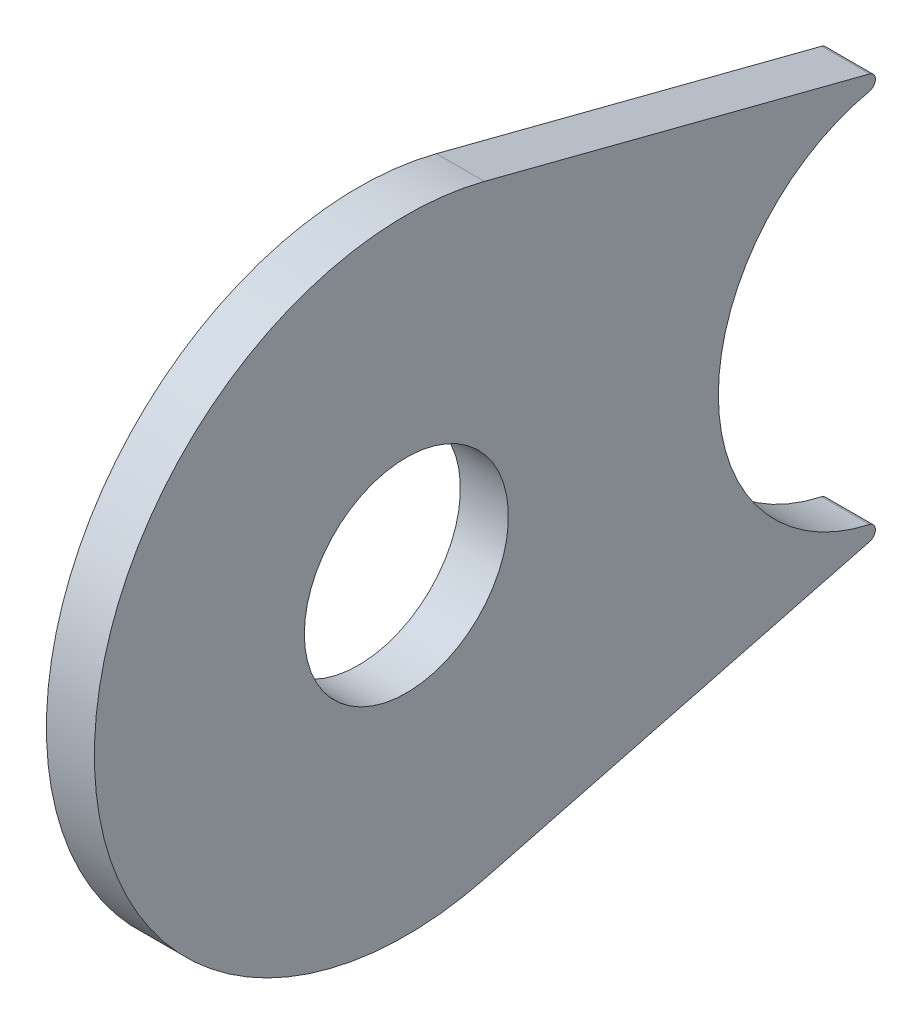
ISO-10303-21;
HEADER;
FILE_DESCRIPTION(('STEP AP214'),'2;1');
FILE_NAME('part.step','',(''),(''),'','','');
FILE_SCHEMA(('AUTOMOTIVE_DESIGN { 1 0 10303 214 1 1 1 1 }'));
ENDSEC;
DATA;
#1=APPLICATION_CONTEXT('core data for automotive mechanical design processes');
#2=APPLICATION_PROTOCOL_DEFINITION('international standard','automotive_design',2000,#1);
#3=PRODUCT_CONTEXT('',#1,'mechanical');
#4=PRODUCT('Part','Part','',(#3));
#5=PRODUCT_RELATED_PRODUCT_CATEGORY('part','',(#4));
#6=PRODUCT_DEFINITION_FORMATION('','',#4);
#7=PRODUCT_DEFINITION_CONTEXT('part definition',#1,'design');
#8=PRODUCT_DEFINITION('design','',#6,#7);
#9=PRODUCT_DEFINITION_SHAPE('','',#8);
#10=(LENGTH_UNIT() NAMED_UNIT(*) SI_UNIT(.MILLI.,.METRE.));
#11=(NAMED_UNIT(*) PLANE_ANGLE_UNIT() SI_UNIT($,.RADIAN.));
#12=(NAMED_UNIT(*) SI_UNIT($,.STERADIAN.) SOLID_ANGLE_UNIT());
#13=UNCERTAINTY_MEASURE_WITH_UNIT(LENGTH_MEASURE(1.E-05),#10,'distance_accuracy_value','');
#14=(GEOMETRIC_REPRESENTATION_CONTEXT(3) GLOBAL_UNCERTAINTY_ASSIGNED_CONTEXT((#13)) GLOBAL_UNIT_ASSIGNED_CONTEXT((#10,
#11,#12)) REPRESENTATION_CONTEXT('',''));
#15=CARTESIAN_POINT('',(0.,0.,0.));
#16=DIRECTION('',(0.,0.,1.));
#17=DIRECTION('',(1.,0.,0.));
#18=AXIS2_PLACEMENT_3D('',#15,#16,#17);
#19=CARTESIAN_POINT('',(1.5875,-19.981037813843,-5.1637713090122));
#20=DIRECTION('',(0.,-0.968190808665922,-0.250213025270125));
#21=DIRECTION('',(0.,0.250213025270125,-0.968190808665922));
#22=AXIS2_PLACEMENT_3D('',#19,#20,#21);
#23=PLANE('',#22);
#24=DIRECTION('',(0.,-0.250213025270125,0.968190808665922));
#25=VECTOR('',#24,1.);
#26=CARTESIAN_POINT('',(-1.5875,-19.981037813843,-5.1637713090122));
#27=LINE('',#26,#25);
#28=CARTESIAN_POINT('',(-1.5875,-13.3955820781879,-30.6459687575827));
#29=VERTEX_POINT('',#28);
#30=CARTESIAN_POINT('',(-1.5875,-19.981037813843,-5.16377130901221));
#31=VERTEX_POINT('',#30);
#32=EDGE_CURVE('E118',#29,#31,#27,.T.);
#33=ORIENTED_EDGE('',*,*,#32,.F.);
#34=DIRECTION('',(1.,0.,0.));
#35=VECTOR('',#34,1.);
#36=CARTESIAN_POINT('',(1.5875,-13.3955820781879,-30.6459687575827));
#37=LINE('',#36,#35);
#38=CARTESIAN_POINT('',(1.5875,-13.3955820781879,-30.6459687575827));
#39=VERTEX_POINT('',#38);
#40=EDGE_CURVE('E131',#29,#39,#37,.T.);
#41=ORIENTED_EDGE('',*,*,#40,.T.);
#42=DIRECTION('',(0.,-0.250213025270125,0.968190808665922));
#43=VECTOR('',#42,1.);
#44=CARTESIAN_POINT('',(1.5875,-19.981037813843,-5.1637713090122));
#45=LINE('',#44,#43);
#46=CARTESIAN_POINT('',(1.5875,-19.981037813843,-5.16377130901221));
#47=VERTEX_POINT('',#46);
#48=EDGE_CURVE('E125',#39,#47,#45,.T.);
#49=ORIENTED_EDGE('',*,*,#48,.T.);
#50=DIRECTION('',(-1.,0.,0.));
#51=VECTOR('',#50,1.);
#52=CARTESIAN_POINT('',(1.5875,-19.981037813843,-5.16377130901221));
#53=LINE('',#52,#51);
#54=EDGE_CURVE('E110',#47,#31,#53,.T.);
#55=ORIENTED_EDGE('',*,*,#54,.T.);
#56=EDGE_LOOP('',(#33,#41,#49,#55));
#57=FACE_BOUND('',#56,.T.);
#58=ADVANCED_FACE('F36',(#57),#23,.T.);
#59=CARTESIAN_POINT('',(1.5875,0.,-33.3375));
#60=DIRECTION('',(-1.,0.,0.));
#61=DIRECTION('',(0.,0.,1.));
#62=AXIS2_PLACEMENT_3D('',#59,#60,#61);
#63=CYLINDRICAL_SURFACE('',#62,12.7);
#64=CARTESIAN_POINT('',(-1.5875,0.,-33.3375));
#65=DIRECTION('',(1.,0.,0.));
#66=DIRECTION('',(0.,0.,-1.));
#67=AXIS2_PLACEMENT_3D('',#64,#65,#66);
#68=CIRCLE('',#67,12.7);
#69=CARTESIAN_POINT('',(-1.5875,-12.4074434109477,-30.6272697507168));
#70=VERTEX_POINT('',#69);
#71=CARTESIAN_POINT('',(-1.5875,12.4074434109477,-30.6272697507168));
#72=VERTEX_POINT('',#71);
#73=EDGE_CURVE('E120',#70,#72,#68,.F.);
#74=ORIENTED_EDGE('',*,*,#73,.T.);
#75=DIRECTION('',(-1.,0.,0.));
#76=VECTOR('',#75,1.);
#77=CARTESIAN_POINT('',(1.5875,12.4074434109477,-30.6272697507168));
#78=LINE('',#77,#76);
#79=CARTESIAN_POINT('',(1.5875,12.4074434109477,-30.6272697507168));
#80=VERTEX_POINT('',#79);
#81=EDGE_CURVE('E44',#72,#80,#78,.F.);
#82=ORIENTED_EDGE('',*,*,#81,.T.);
#83=CARTESIAN_POINT('',(1.5875,0.,-33.3375));
#84=DIRECTION('',(1.,0.,0.));
#85=DIRECTION('',(0.,0.,-1.));
#86=AXIS2_PLACEMENT_3D('',#83,#84,#85);
#87=CIRCLE('',#86,12.7);
#88=CARTESIAN_POINT('',(1.5875,-12.4074434109477,-30.6272697507168));
#89=VERTEX_POINT('',#88);
#90=EDGE_CURVE('E100',#89,#80,#87,.F.);
#91=ORIENTED_EDGE('',*,*,#90,.F.);
#92=DIRECTION('',(-1.,0.,0.));
#93=VECTOR('',#92,1.);
#94=CARTESIAN_POINT('',(1.5875,-12.4074434109477,-30.6272697507168));
#95=LINE('',#94,#93);
#96=EDGE_CURVE('E109',#89,#70,#95,.T.);
#97=ORIENTED_EDGE('',*,*,#96,.T.);
#98=EDGE_LOOP('',(#74,#82,#91,#97));
#99=FACE_BOUND('',#98,.T.);
#100=ADVANCED_FACE('F165',(#99),#63,.F.);
#101=CARTESIAN_POINT('',(1.5875,19.981037813843,-5.1637713090122));
#102=DIRECTION('',(0.,-0.968190808665922,0.250213025270125));
#103=DIRECTION('',(0.,-0.250213025270125,-0.968190808665922));
#104=AXIS2_PLACEMENT_3D('',#101,#102,#103);
#105=PLANE('',#104);
#106=DIRECTION('',(0.,0.250213025270125,0.968190808665922));
#107=VECTOR('',#106,1.);
#108=CARTESIAN_POINT('',(1.5875,19.981037813843,-5.1637713090122));
#109=LINE('',#108,#107);
#110=CARTESIAN_POINT('',(1.5875,13.3955820781879,-30.6459687575827));
#111=VERTEX_POINT('',#110);
#112=CARTESIAN_POINT('',(1.5875,19.981037813843,-5.16377130901221));
#113=VERTEX_POINT('',#112);
#114=EDGE_CURVE('E89',#111,#113,#109,.T.);
#115=ORIENTED_EDGE('',*,*,#114,.F.);
#116=DIRECTION('',(-1.,0.,0.));
#117=VECTOR('',#116,1.);
#118=CARTESIAN_POINT('',(1.5875,13.3955820781879,-30.6459687575827));
#119=LINE('',#118,#117);
#120=CARTESIAN_POINT('',(-1.5875,13.3955820781879,-30.6459687575827));
#121=VERTEX_POINT('',#120);
#122=EDGE_CURVE('E135',#111,#121,#119,.T.);
#123=ORIENTED_EDGE('',*,*,#122,.T.);
#124=DIRECTION('',(0.,0.250213025270125,0.968190808665922));
#125=VECTOR('',#124,1.);
#126=CARTESIAN_POINT('',(-1.5875,19.981037813843,-5.1637713090122));
#127=LINE('',#126,#125);
#128=CARTESIAN_POINT('',(-1.5875,19.981037813843,-5.16377130901221));
#129=VERTEX_POINT('',#128);
#130=EDGE_CURVE('E105',#121,#129,#127,.T.);
#131=ORIENTED_EDGE('',*,*,#130,.T.);
#132=DIRECTION('',(-1.,0.,0.));
#133=VECTOR('',#132,1.);
#134=CARTESIAN_POINT('',(1.5875,19.981037813843,-5.16377130901221));
#135=LINE('',#134,#133);
#136=EDGE_CURVE('E103',#113,#129,#135,.T.);
#137=ORIENTED_EDGE('',*,*,#136,.F.);
#138=EDGE_LOOP('',(#115,#123,#131,#137));
#139=FACE_BOUND('',#138,.T.);
#140=ADVANCED_FACE('F104',(#139),#105,.F.);
#141=CARTESIAN_POINT('',(1.5875,0.,0.));
#142=DIRECTION('',(-1.,0.,0.));
#143=DIRECTION('',(0.,0.,1.));
#144=AXIS2_PLACEMENT_3D('',#141,#142,#143);
#145=CYLINDRICAL_SURFACE('',#144,20.6375);
#146=CARTESIAN_POINT('',(-1.5875,0.,0.));
#147=DIRECTION('',(1.,0.,0.));
#148=DIRECTION('',(0.,0.,-1.));
#149=AXIS2_PLACEMENT_3D('',#146,#147,#148);
#150=CIRCLE('',#149,20.6375);
#151=EDGE_CURVE('E124',#129,#31,#150,.T.);
#152=ORIENTED_EDGE('',*,*,#151,.T.);
#153=ORIENTED_EDGE('',*,*,#54,.F.);
#154=CARTESIAN_POINT('',(1.5875,0.,0.));
#155=DIRECTION('',(1.,0.,0.));
#156=DIRECTION('',(0.,0.,-1.));
#157=AXIS2_PLACEMENT_3D('',#154,#155,#156);
#158=CIRCLE('',#157,20.6375);
#159=EDGE_CURVE('E94',#113,#47,#158,.T.);
#160=ORIENTED_EDGE('',*,*,#159,.F.);
#161=ORIENTED_EDGE('',*,*,#136,.T.);
#162=EDGE_LOOP('',(#152,#153,#160,#161));
#163=FACE_BOUND('',#162,.T.);
#164=ADVANCED_FACE('F112',(#163),#145,.T.);
#165=CARTESIAN_POINT('',(1.5875,0.,0.));
#166=DIRECTION('',(1.,0.,0.));
#167=DIRECTION('',(0.,0.,-1.));
#168=AXIS2_PLACEMENT_3D('',#165,#166,#167);
#169=PLANE('',#168);
#170=CARTESIAN_POINT('',(1.5875,0.,0.));
#171=DIRECTION('',(-1.,0.,0.));
#172=DIRECTION('',(0.,0.,1.));
#173=AXIS2_PLACEMENT_3D('',#170,#171,#172);
#174=CIRCLE('',#173,6.75);
#175=CARTESIAN_POINT('',(1.5875,0.,6.75));
#176=VERTEX_POINT('',#175);
#177=EDGE_CURVE('E121',#176,#176,#174,.T.);
#178=ORIENTED_EDGE('',*,*,#177,.T.);
#179=EDGE_LOOP('',(#178));
#180=FACE_BOUND('',#179,.T.);
#181=ORIENTED_EDGE('',*,*,#90,.T.);
#182=CARTESIAN_POINT('',(1.5875,12.9037411473856,-30.5188605407455));
#183=DIRECTION('',(1.,0.,0.));
#184=DIRECTION('',(0.,0.,-1.));
#185=AXIS2_PLACEMENT_3D('',#182,#183,#184);
#186=CIRCLE('',#185,0.508);
#187=EDGE_CURVE('E11',#80,#111,#186,.T.);
#188=ORIENTED_EDGE('',*,*,#187,.T.);
#189=ORIENTED_EDGE('',*,*,#114,.T.);
#190=ORIENTED_EDGE('',*,*,#159,.T.);
#191=ORIENTED_EDGE('',*,*,#48,.F.);
#192=CARTESIAN_POINT('',(1.5875,-12.9037411473856,-30.5188605407455));
#193=DIRECTION('',(1.,0.,0.));
#194=DIRECTION('',(0.,0.,-1.));
#195=AXIS2_PLACEMENT_3D('',#192,#193,#194);
#196=CIRCLE('',#195,0.508);
#197=EDGE_CURVE('E133',#39,#89,#196,.T.);
#198=ORIENTED_EDGE('',*,*,#197,.T.);
#199=EDGE_LOOP('',(#181,#188,#189,#190,#191,#198));
#200=FACE_BOUND('',#199,.T.);
#201=ADVANCED_FACE('F91',(#180,#200),#169,.T.);
#202=CARTESIAN_POINT('',(-1.5875,0.,0.));
#203=DIRECTION('',(1.,0.,0.));
#204=DIRECTION('',(0.,0.,-1.));
#205=AXIS2_PLACEMENT_3D('',#202,#203,#204);
#206=PLANE('',#205);
#207=CARTESIAN_POINT('',(-1.5875,0.,0.));
#208=DIRECTION('',(-1.,0.,0.));
#209=DIRECTION('',(0.,0.,1.));
#210=AXIS2_PLACEMENT_3D('',#207,#208,#209);
#211=CIRCLE('',#210,6.75);
#212=CARTESIAN_POINT('',(-1.5875,0.,6.75));
#213=VERTEX_POINT('',#212);
#214=EDGE_CURVE('E147',#213,#213,#211,.T.);
#215=ORIENTED_EDGE('',*,*,#214,.F.);
#216=EDGE_LOOP('',(#215));
#217=FACE_BOUND('',#216,.T.);
#218=ORIENTED_EDGE('',*,*,#130,.F.);
#219=CARTESIAN_POINT('',(-1.5875,12.9037411473856,-30.5188605407455));
#220=DIRECTION('',(1.,0.,0.));
#221=DIRECTION('',(0.,0.,-1.));
#222=AXIS2_PLACEMENT_3D('',#219,#220,#221);
#223=CIRCLE('',#222,0.508);
#224=EDGE_CURVE('E58',#121,#72,#223,.F.);
#225=ORIENTED_EDGE('',*,*,#224,.T.);
#226=ORIENTED_EDGE('',*,*,#73,.F.);
#227=CARTESIAN_POINT('',(-1.5875,-12.9037411473856,-30.5188605407455));
#228=DIRECTION('',(1.,0.,0.));
#229=DIRECTION('',(0.,0.,-1.));
#230=AXIS2_PLACEMENT_3D('',#227,#228,#229);
#231=CIRCLE('',#230,0.508);
#232=EDGE_CURVE('E129',#70,#29,#231,.F.);
#233=ORIENTED_EDGE('',*,*,#232,.T.);
#234=ORIENTED_EDGE('',*,*,#32,.T.);
#235=ORIENTED_EDGE('',*,*,#151,.F.);
#236=EDGE_LOOP('',(#218,#225,#226,#233,#234,#235));
#237=FACE_BOUND('',#236,.T.);
#238=ADVANCED_FACE('F138',(#217,#237),#206,.F.);
#239=CARTESIAN_POINT('',(1.5875,-12.9037411473856,-30.5188605407455));
#240=DIRECTION('',(-1.,0.,0.));
#241=DIRECTION('',(0.,0.,1.));
#242=AXIS2_PLACEMENT_3D('',#239,#240,#241);
#243=CYLINDRICAL_SURFACE('',#242,0.508);
#244=ORIENTED_EDGE('',*,*,#197,.F.);
#245=ORIENTED_EDGE('',*,*,#40,.F.);
#246=ORIENTED_EDGE('',*,*,#232,.F.);
#247=ORIENTED_EDGE('',*,*,#96,.F.);
#248=EDGE_LOOP('',(#244,#245,#246,#247));
#249=FACE_BOUND('',#248,.T.);
#250=ADVANCED_FACE('F154',(#249),#243,.T.);
#251=CARTESIAN_POINT('',(1.5875,12.9037411473856,-30.5188605407455));
#252=DIRECTION('',(-1.,0.,0.));
#253=DIRECTION('',(0.,0.,1.));
#254=AXIS2_PLACEMENT_3D('',#251,#252,#253);
#255=CYLINDRICAL_SURFACE('',#254,0.508);
#256=ORIENTED_EDGE('',*,*,#187,.F.);
#257=ORIENTED_EDGE('',*,*,#81,.F.);
#258=ORIENTED_EDGE('',*,*,#224,.F.);
#259=ORIENTED_EDGE('',*,*,#122,.F.);
#260=EDGE_LOOP('',(#256,#257,#258,#259));
#261=FACE_BOUND('',#260,.T.);
#262=ADVANCED_FACE('F38',(#261),#255,.T.);
#263=CARTESIAN_POINT('',(-1.5875,0.,0.));
#264=DIRECTION('',(-1.,0.,0.));
#265=DIRECTION('',(0.,0.,1.));
#266=AXIS2_PLACEMENT_3D('',#263,#264,#265);
#267=CYLINDRICAL_SURFACE('',#266,6.75);
#268=ORIENTED_EDGE('',*,*,#177,.F.);
#269=EDGE_LOOP('',(#268));
#270=FACE_BOUND('',#269,.T.);
#271=ORIENTED_EDGE('',*,*,#214,.T.);
#272=EDGE_LOOP('',(#271));
#273=FACE_BOUND('',#272,.T.);
#274=ADVANCED_FACE('F151',(#270,#273),#267,.F.);
#275=CLOSED_SHELL('',(#58,#100,#140,#164,#201,#238,#250,#262,#274));
#276=MANIFOLD_SOLID_BREP('B2',#275);
#277=ADVANCED_BREP_SHAPE_REPRESENTATION('',(#18,#276),#14);
#278=SHAPE_DEFINITION_REPRESENTATION(#9,#277);
ENDSEC;
END-ISO-10303-21;
